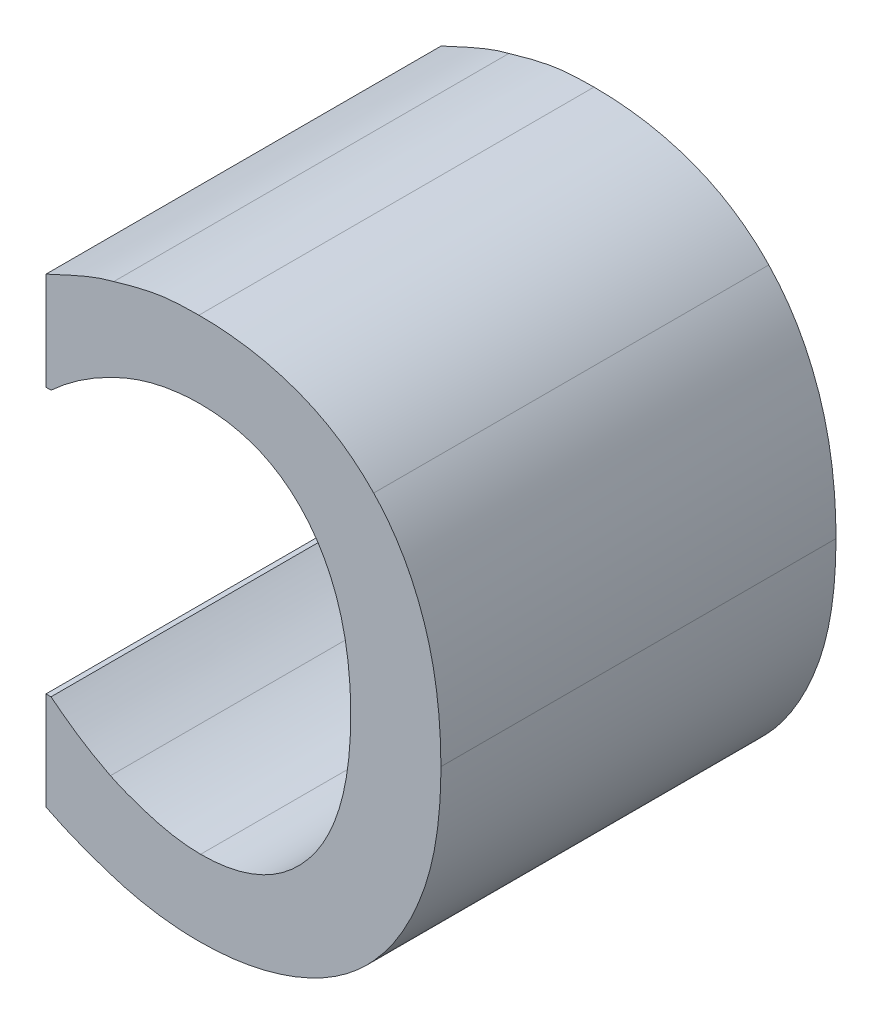
ISO-10303-21;
HEADER;
FILE_DESCRIPTION(('STEP AP214'),'2;1');
FILE_NAME('part.step','',(''),(''),'','','');
FILE_SCHEMA(('AUTOMOTIVE_DESIGN { 1 0 10303 214 1 1 1 1 }'));
ENDSEC;
DATA;
#1=APPLICATION_CONTEXT('core data for automotive mechanical design processes');
#2=APPLICATION_PROTOCOL_DEFINITION('international standard','automotive_design',2000,#1);
#3=PRODUCT_CONTEXT('',#1,'mechanical');
#4=PRODUCT('Part','Part','',(#3));
#5=PRODUCT_RELATED_PRODUCT_CATEGORY('part','',(#4));
#6=PRODUCT_DEFINITION_FORMATION('','',#4);
#7=PRODUCT_DEFINITION_CONTEXT('part definition',#1,'design');
#8=PRODUCT_DEFINITION('design','',#6,#7);
#9=PRODUCT_DEFINITION_SHAPE('','',#8);
#10=(LENGTH_UNIT() NAMED_UNIT(*) SI_UNIT(.MILLI.,.METRE.));
#11=(NAMED_UNIT(*) PLANE_ANGLE_UNIT() SI_UNIT($,.RADIAN.));
#12=(NAMED_UNIT(*) SI_UNIT($,.STERADIAN.) SOLID_ANGLE_UNIT());
#13=UNCERTAINTY_MEASURE_WITH_UNIT(LENGTH_MEASURE(1.E-05),#10,'distance_accuracy_value','');
#14=(GEOMETRIC_REPRESENTATION_CONTEXT(3) GLOBAL_UNCERTAINTY_ASSIGNED_CONTEXT((#13)) GLOBAL_UNIT_ASSIGNED_CONTEXT((#10,
#11,#12)) REPRESENTATION_CONTEXT('',''));
#15=CARTESIAN_POINT('',(0.,0.,0.));
#16=DIRECTION('',(0.,0.,1.));
#17=DIRECTION('',(1.,0.,0.));
#18=AXIS2_PLACEMENT_3D('',#15,#16,#17);
#19=CARTESIAN_POINT('',(5.9608266346337,1.5887755566552,0.));
#20=CARTESIAN_POINT('',(5.9608266346337,1.5887755566552,0.1));
#21=CARTESIAN_POINT('',(5.9608266346337,1.6060730616714,0.));
#22=CARTESIAN_POINT('',(5.9608266346337,1.6060730616714,0.1));
#23=CARTESIAN_POINT('',(5.9518943164696,1.6318775363677,0.));
#24=CARTESIAN_POINT('',(5.9518943164696,1.6318775363677,0.1));
#25=CARTESIAN_POINT('',(5.9438126952735,1.6402427232198,0.));
#26=CARTESIAN_POINT('',(5.9438126952735,1.6402427232198,0.1));
#27=B_SPLINE_SURFACE_WITH_KNOTS('',2,1,((#19,#20),(#21,#22),(#23,#24),(#25,#26)),.UNSPECIFIED.,
.F.,.F.,.F.,(3,1,3),(2,2),(-2.,-1.,0.),(0.,0.01),.UNSPECIFIED.);
#28=CARTESIAN_POINT('',(5.9438126952735,1.6402427232198,0.));
#29=CARTESIAN_POINT('',(5.9518943164696,1.6318775363677,0.));
#30=CARTESIAN_POINT('',(5.9608266346337,1.6060730616714,0.));
#31=CARTESIAN_POINT('',(5.9608266346337,1.5887755566552,0.));
#32=B_SPLINE_CURVE_WITH_KNOTS('',2,(#28,#29,#30,#31),.UNSPECIFIED.,.F.,.F.,(3,1,3),(0.,1.,2.),.UNSPECIFIED.);
#33=CARTESIAN_POINT('',(5.9438126952735,1.6402427232198,0.));
#34=VERTEX_POINT('',#33);
#35=CARTESIAN_POINT('',(5.9608266346337,1.5887755566552,0.));
#36=VERTEX_POINT('',#35);
#37=EDGE_CURVE('E11',#34,#36,#32,.T.);
#38=DIRECTION('',(0.,0.,1.));
#39=VECTOR('',#38,1.);
#40=CARTESIAN_POINT('',(5.9438126952735,1.6402427232198,0.));
#41=LINE('',#40,#39);
#42=CARTESIAN_POINT('',(5.9438126952735,1.6402427232198,0.1));
#43=VERTEX_POINT('',#42);
#44=EDGE_CURVE('E28',#34,#43,#41,.T.);
#45=CARTESIAN_POINT('',(5.9608266346337,1.5887755566552,0.1));
#46=CARTESIAN_POINT('',(5.9608266346337,1.6060730616714,0.1));
#47=CARTESIAN_POINT('',(5.9518943164696,1.6318775363677,0.1));
#48=CARTESIAN_POINT('',(5.9438126952735,1.6402427232198,0.1));
#49=B_SPLINE_CURVE_WITH_KNOTS('',2,(#45,#46,#47,#48),.UNSPECIFIED.,.F.,.F.,(3,1,3),(-2.,-1.,0.),.UNSPECIFIED.);
#50=CARTESIAN_POINT('',(5.9608266346337,1.5887755566552,0.1));
#51=VERTEX_POINT('',#50);
#52=EDGE_CURVE('E152',#51,#43,#49,.T.);
#53=DIRECTION('',(0.,0.,1.));
#54=VECTOR('',#53,1.);
#55=CARTESIAN_POINT('',(5.9608266346337,1.5887755566552,0.));
#56=LINE('',#55,#54);
#57=EDGE_CURVE('E364',#36,#51,#56,.T.);
#58=ORIENTED_EDGE('',*,*,#37,.F.);
#59=ORIENTED_EDGE('',*,*,#44,.T.);
#60=ORIENTED_EDGE('',*,*,#52,.F.);
#61=ORIENTED_EDGE('',*,*,#57,.F.);
#62=EDGE_LOOP('',(#58,#59,#60,#61));
#63=FACE_BOUND('',#62,.T.);
#64=ADVANCED_FACE('F17',(#63),#27,.T.);
#65=CARTESIAN_POINT('',(5.9438126952735,1.5377337385748,0.));
#66=CARTESIAN_POINT('',(5.9438126952735,1.5377337385748,0.1));
#67=CARTESIAN_POINT('',(5.9516107508136,1.5462407082548,0.));
#68=CARTESIAN_POINT('',(5.9516107508136,1.5462407082548,0.1));
#69=CARTESIAN_POINT('',(5.9608266346337,1.5714780516391,0.));
#70=CARTESIAN_POINT('',(5.9608266346337,1.5714780516391,0.1));
#71=CARTESIAN_POINT('',(5.9608266346337,1.5887755566552,0.));
#72=CARTESIAN_POINT('',(5.9608266346337,1.5887755566552,0.1));
#73=B_SPLINE_SURFACE_WITH_KNOTS('',2,1,((#65,#66),(#67,#68),(#69,#70),(#71,#72)),.UNSPECIFIED.,
.F.,.F.,.F.,(3,1,3),(2,2),(-2.,-1.,0.),(0.,0.01),.UNSPECIFIED.);
#74=CARTESIAN_POINT('',(5.9608266346337,1.5887755566552,0.));
#75=CARTESIAN_POINT('',(5.9608266346337,1.5714780516391,0.));
#76=CARTESIAN_POINT('',(5.9516107508136,1.5462407082548,0.));
#77=CARTESIAN_POINT('',(5.9438126952735,1.5377337385748,0.));
#78=B_SPLINE_CURVE_WITH_KNOTS('',2,(#74,#75,#76,#77),.UNSPECIFIED.,.F.,.F.,(3,1,3),(0.,1.,2.),.UNSPECIFIED.);
#79=CARTESIAN_POINT('',(5.9438126952735,1.5377337385748,0.));
#80=VERTEX_POINT('',#79);
#81=EDGE_CURVE('E357',#36,#80,#78,.T.);
#82=CARTESIAN_POINT('',(5.9438126952735,1.5377337385748,0.1));
#83=CARTESIAN_POINT('',(5.9516107508136,1.5462407082548,0.1));
#84=CARTESIAN_POINT('',(5.9608266346337,1.5714780516391,0.1));
#85=CARTESIAN_POINT('',(5.9608266346337,1.5887755566552,0.1));
#86=B_SPLINE_CURVE_WITH_KNOTS('',2,(#82,#83,#84,#85),.UNSPECIFIED.,.F.,.F.,(3,1,3),(-2.,-1.,0.),.UNSPECIFIED.);
#87=CARTESIAN_POINT('',(5.9438126952735,1.5377337385748,0.1));
#88=VERTEX_POINT('',#87);
#89=EDGE_CURVE('E353',#88,#51,#86,.T.);
#90=DIRECTION('',(0.,0.,1.));
#91=VECTOR('',#90,1.);
#92=CARTESIAN_POINT('',(5.9438126952735,1.5377337385748,0.));
#93=LINE('',#92,#91);
#94=EDGE_CURVE('E347',#80,#88,#93,.T.);
#95=ORIENTED_EDGE('',*,*,#81,.F.);
#96=ORIENTED_EDGE('',*,*,#57,.T.);
#97=ORIENTED_EDGE('',*,*,#89,.F.);
#98=ORIENTED_EDGE('',*,*,#94,.F.);
#99=EDGE_LOOP('',(#95,#96,#97,#98));
#100=FACE_BOUND('',#99,.T.);
#101=ADVANCED_FACE('F426',(#100),#73,.T.);
#102=CARTESIAN_POINT('',(5.8995764529371,1.5198691022466,0.));
#103=CARTESIAN_POINT('',(5.8995764529371,1.5198691022466,0.1));
#104=CARTESIAN_POINT('',(5.9129040387692,1.5198691022466,0.));
#105=CARTESIAN_POINT('',(5.9129040387692,1.5198691022466,0.1));
#106=CARTESIAN_POINT('',(5.9360146397334,1.5290849860667,0.));
#107=CARTESIAN_POINT('',(5.9360146397334,1.5290849860667,0.1));
#108=CARTESIAN_POINT('',(5.9438126952735,1.5377337385748,0.));
#109=CARTESIAN_POINT('',(5.9438126952735,1.5377337385748,0.1));
#110=B_SPLINE_SURFACE_WITH_KNOTS('',2,1,((#102,#103),(#104,#105),(#106,#107),(#108,#109)),
.UNSPECIFIED.,.F.,.F.,.F.,(3,1,3),(2,2),(-2.,-1.,0.),(0.,0.01),.UNSPECIFIED.);
#111=CARTESIAN_POINT('',(5.9438126952735,1.5377337385748,0.));
#112=CARTESIAN_POINT('',(5.9360146397334,1.5290849860667,0.));
#113=CARTESIAN_POINT('',(5.9129040387692,1.5198691022466,0.));
#114=CARTESIAN_POINT('',(5.8995764529371,1.5198691022466,0.));
#115=B_SPLINE_CURVE_WITH_KNOTS('',2,(#111,#112,#113,#114),.UNSPECIFIED.,.F.,.F.,(3,1,3),(0.,1.,
2.),.UNSPECIFIED.);
#116=CARTESIAN_POINT('',(5.8995764529371,1.5198691022466,0.));
#117=VERTEX_POINT('',#116);
#118=EDGE_CURVE('E340',#80,#117,#115,.T.);
#119=CARTESIAN_POINT('',(5.8995764529371,1.5198691022466,0.1));
#120=CARTESIAN_POINT('',(5.9129040387692,1.5198691022466,0.1));
#121=CARTESIAN_POINT('',(5.9360146397334,1.5290849860667,0.1));
#122=CARTESIAN_POINT('',(5.9438126952735,1.5377337385748,0.1));
#123=B_SPLINE_CURVE_WITH_KNOTS('',2,(#119,#120,#121,#122),.UNSPECIFIED.,.F.,.F.,(3,1,3),(-2.,
-1.,0.),.UNSPECIFIED.);
#124=CARTESIAN_POINT('',(5.8995764529371,1.5198691022466,0.1));
#125=VERTEX_POINT('',#124);
#126=EDGE_CURVE('E335',#125,#88,#123,.T.);
#127=DIRECTION('',(0.,0.,1.));
#128=VECTOR('',#127,1.);
#129=CARTESIAN_POINT('',(5.8995764529371,1.5198691022466,0.));
#130=LINE('',#129,#128);
#131=EDGE_CURVE('E329',#117,#125,#130,.T.);
#132=ORIENTED_EDGE('',*,*,#118,.F.);
#133=ORIENTED_EDGE('',*,*,#94,.T.);
#134=ORIENTED_EDGE('',*,*,#126,.F.);
#135=ORIENTED_EDGE('',*,*,#131,.F.);
#136=EDGE_LOOP('',(#132,#133,#134,#135));
#137=FACE_BOUND('',#136,.T.);
#138=ADVANCED_FACE('F422',(#137),#110,.T.);
#139=CARTESIAN_POINT('',(5.8608697408927,1.5299356830347,0.));
#140=CARTESIAN_POINT('',(5.8608697408927,1.5299356830347,0.1));
#141=CARTESIAN_POINT('',(5.8686677964328,1.5259657638506,0.));
#142=CARTESIAN_POINT('',(5.8686677964328,1.5259657638506,0.1));
#143=CARTESIAN_POINT('',(5.888800958009,1.5198691022466,0.));
#144=CARTESIAN_POINT('',(5.888800958009,1.5198691022466,0.1));
#145=CARTESIAN_POINT('',(5.8995764529371,1.5198691022466,0.));
#146=CARTESIAN_POINT('',(5.8995764529371,1.5198691022466,0.1));
#147=B_SPLINE_SURFACE_WITH_KNOTS('',2,1,((#139,#140),(#141,#142),(#143,#144),(#145,#146)),
.UNSPECIFIED.,.F.,.F.,.F.,(3,1,3),(2,2),(-2.,-1.,0.),(0.,0.01),.UNSPECIFIED.);
#148=CARTESIAN_POINT('',(5.8995764529371,1.5198691022466,0.));
#149=CARTESIAN_POINT('',(5.888800958009,1.5198691022466,0.));
#150=CARTESIAN_POINT('',(5.8686677964328,1.5259657638506,0.));
#151=CARTESIAN_POINT('',(5.8608697408927,1.5299356830347,0.));
#152=B_SPLINE_CURVE_WITH_KNOTS('',2,(#148,#149,#150,#151),.UNSPECIFIED.,.F.,.F.,(3,1,3),(0.,1.,
2.),.UNSPECIFIED.);
#153=CARTESIAN_POINT('',(5.8608697408927,1.5299356830347,0.));
#154=VERTEX_POINT('',#153);
#155=EDGE_CURVE('E322',#117,#154,#152,.T.);
#156=CARTESIAN_POINT('',(5.8608697408927,1.5299356830347,0.1));
#157=CARTESIAN_POINT('',(5.8686677964328,1.5259657638506,0.1));
#158=CARTESIAN_POINT('',(5.888800958009,1.5198691022466,0.1));
#159=CARTESIAN_POINT('',(5.8995764529371,1.5198691022466,0.1));
#160=B_SPLINE_CURVE_WITH_KNOTS('',2,(#156,#157,#158,#159),.UNSPECIFIED.,.F.,.F.,(3,1,3),(-2.,
-1.,0.),.UNSPECIFIED.);
#161=CARTESIAN_POINT('',(5.8608697408927,1.5299356830347,0.1));
#162=VERTEX_POINT('',#161);
#163=EDGE_CURVE('E317',#162,#125,#160,.T.);
#164=DIRECTION('',(0.,0.,1.));
#165=VECTOR('',#164,1.);
#166=CARTESIAN_POINT('',(5.8608697408927,1.5299356830347,0.));
#167=LINE('',#166,#165);
#168=EDGE_CURVE('E314',#154,#162,#167,.T.);
#169=ORIENTED_EDGE('',*,*,#155,.F.);
#170=ORIENTED_EDGE('',*,*,#131,.T.);
#171=ORIENTED_EDGE('',*,*,#163,.F.);
#172=ORIENTED_EDGE('',*,*,#168,.F.);
#173=EDGE_LOOP('',(#169,#170,#171,#172));
#174=FACE_BOUND('',#173,.T.);
#175=ADVANCED_FACE('F418',(#174),#147,.T.);
#176=CARTESIAN_POINT('',(5.8608697408927,1.5547476779349,0.));
#177=DIRECTION('',(-1.,0.,0.));
#178=DIRECTION('',(0.,-1.,0.));
#179=AXIS2_PLACEMENT_3D('',#176,#177,#178);
#180=PLANE('',#179);
#181=DIRECTION('',(0.,1.,0.));
#182=VECTOR('',#181,1.);
#183=CARTESIAN_POINT('',(5.8608697408927,1.5299356830347,0.));
#184=LINE('',#183,#182);
#185=CARTESIAN_POINT('',(5.8608697408927,1.5547476779349,0.));
#186=VERTEX_POINT('',#185);
#187=EDGE_CURVE('E312',#154,#186,#184,.T.);
#188=ORIENTED_EDGE('',*,*,#187,.F.);
#189=ORIENTED_EDGE('',*,*,#168,.T.);
#190=DIRECTION('',(0.,-1.,0.));
#191=VECTOR('',#190,1.);
#192=CARTESIAN_POINT('',(5.8608697408927,1.5299356830347,0.1));
#193=LINE('',#192,#191);
#194=CARTESIAN_POINT('',(5.8608697408927,1.5547476779349,0.1));
#195=VERTEX_POINT('',#194);
#196=EDGE_CURVE('E309',#195,#162,#193,.T.);
#197=ORIENTED_EDGE('',*,*,#196,.F.);
#198=DIRECTION('',(0.,0.,1.));
#199=VECTOR('',#198,1.);
#200=CARTESIAN_POINT('',(5.8608697408927,1.5547476779349,0.));
#201=LINE('',#200,#199);
#202=EDGE_CURVE('E306',#186,#195,#201,.T.);
#203=ORIENTED_EDGE('',*,*,#202,.F.);
#204=EDGE_LOOP('',(#188,#189,#197,#203));
#205=FACE_BOUND('',#204,.T.);
#206=ADVANCED_FACE('F414',(#205),#180,.T.);
#207=CARTESIAN_POINT('',(5.8621457863447,1.5547476779349,0.));
#208=DIRECTION('',(0.,1.,0.));
#209=DIRECTION('',(-1.,0.,0.));
#210=AXIS2_PLACEMENT_3D('',#207,#208,#209);
#211=PLANE('',#210);
#212=DIRECTION('',(1.,0.,0.));
#213=VECTOR('',#212,1.);
#214=CARTESIAN_POINT('',(5.8608697408927,1.5547476779349,0.));
#215=LINE('',#214,#213);
#216=CARTESIAN_POINT('',(5.8621457863447,1.5547476779349,0.));
#217=VERTEX_POINT('',#216);
#218=EDGE_CURVE('E304',#186,#217,#215,.T.);
#219=ORIENTED_EDGE('',*,*,#218,.F.);
#220=ORIENTED_EDGE('',*,*,#202,.T.);
#221=DIRECTION('',(-1.,0.,0.));
#222=VECTOR('',#221,1.);
#223=CARTESIAN_POINT('',(5.8608697408927,1.5547476779349,0.1));
#224=LINE('',#223,#222);
#225=CARTESIAN_POINT('',(5.8621457863447,1.5547476779349,0.1));
#226=VERTEX_POINT('',#225);
#227=EDGE_CURVE('E301',#226,#195,#224,.T.);
#228=ORIENTED_EDGE('',*,*,#227,.F.);
#229=DIRECTION('',(0.,0.,1.));
#230=VECTOR('',#229,1.);
#231=CARTESIAN_POINT('',(5.8621457863447,1.5547476779349,0.));
#232=LINE('',#231,#230);
#233=EDGE_CURVE('E295',#217,#226,#232,.T.);
#234=ORIENTED_EDGE('',*,*,#233,.F.);
#235=EDGE_LOOP('',(#219,#220,#228,#234));
#236=FACE_BOUND('',#235,.T.);
#237=ADVANCED_FACE('F410',(#236),#211,.T.);
#238=CARTESIAN_POINT('',(5.8771747661129,1.5449646628028,0.));
#239=CARTESIAN_POINT('',(5.8771747661129,1.5449646628028,0.1));
#240=CARTESIAN_POINT('',(5.8719288014768,1.5476585365349,0.));
#241=CARTESIAN_POINT('',(5.8719288014768,1.5476585365349,0.1));
#242=CARTESIAN_POINT('',(5.8645560944207,1.5527627183429,0.));
#243=CARTESIAN_POINT('',(5.8645560944207,1.5527627183429,0.1));
#244=CARTESIAN_POINT('',(5.8621457863447,1.5547476779349,0.));
#245=CARTESIAN_POINT('',(5.8621457863447,1.5547476779349,0.1));
#246=B_SPLINE_SURFACE_WITH_KNOTS('',2,1,((#238,#239),(#240,#241),(#242,#243),(#244,#245)),
.UNSPECIFIED.,.F.,.F.,.F.,(3,1,3),(2,2),(-2.,-1.,0.),(0.,0.01),.UNSPECIFIED.);
#247=CARTESIAN_POINT('',(5.8621457863447,1.5547476779349,0.));
#248=CARTESIAN_POINT('',(5.8645560944207,1.5527627183429,0.));
#249=CARTESIAN_POINT('',(5.8719288014768,1.5476585365349,0.));
#250=CARTESIAN_POINT('',(5.8771747661129,1.5449646628028,0.));
#251=B_SPLINE_CURVE_WITH_KNOTS('',2,(#247,#248,#249,#250),.UNSPECIFIED.,.F.,.F.,(3,1,3),(0.,1.,
2.),.UNSPECIFIED.);
#252=CARTESIAN_POINT('',(5.8771747661129,1.5449646628028,0.));
#253=VERTEX_POINT('',#252);
#254=EDGE_CURVE('E288',#217,#253,#251,.T.);
#255=CARTESIAN_POINT('',(5.8771747661129,1.5449646628028,0.1));
#256=CARTESIAN_POINT('',(5.8719288014768,1.5476585365349,0.1));
#257=CARTESIAN_POINT('',(5.8645560944207,1.5527627183429,0.1));
#258=CARTESIAN_POINT('',(5.8621457863447,1.5547476779349,0.1));
#259=B_SPLINE_CURVE_WITH_KNOTS('',2,(#255,#256,#257,#258),.UNSPECIFIED.,.F.,.F.,(3,1,3),(-2.,
-1.,0.),.UNSPECIFIED.);
#260=CARTESIAN_POINT('',(5.8771747661129,1.5449646628028,0.1));
#261=VERTEX_POINT('',#260);
#262=EDGE_CURVE('E283',#261,#226,#259,.T.);
#263=DIRECTION('',(0.,0.,1.));
#264=VECTOR('',#263,1.);
#265=CARTESIAN_POINT('',(5.8771747661129,1.5449646628028,0.));
#266=LINE('',#265,#264);
#267=EDGE_CURVE('E277',#253,#261,#266,.T.);
#268=ORIENTED_EDGE('',*,*,#254,.F.);
#269=ORIENTED_EDGE('',*,*,#233,.T.);
#270=ORIENTED_EDGE('',*,*,#262,.F.);
#271=ORIENTED_EDGE('',*,*,#267,.F.);
#272=EDGE_LOOP('',(#268,#269,#270,#271));
#273=FACE_BOUND('',#272,.T.);
#274=ADVANCED_FACE('F406',(#273),#246,.T.);
#275=CARTESIAN_POINT('',(5.9000018014211,1.5391515668548,0.));
#276=CARTESIAN_POINT('',(5.9000018014211,1.5391515668548,0.1));
#277=CARTESIAN_POINT('',(5.894330488301,1.5391515668548,0.));
#278=CARTESIAN_POINT('',(5.894330488301,1.5391515668548,0.1));
#279=CARTESIAN_POINT('',(5.8818535994369,1.5426961375548,0.));
#280=CARTESIAN_POINT('',(5.8818535994369,1.5426961375548,0.1));
#281=CARTESIAN_POINT('',(5.8771747661129,1.5449646628028,0.));
#282=CARTESIAN_POINT('',(5.8771747661129,1.5449646628028,0.1));
#283=B_SPLINE_SURFACE_WITH_KNOTS('',2,1,((#275,#276),(#277,#278),(#279,#280),(#281,#282)),
.UNSPECIFIED.,.F.,.F.,.F.,(3,1,3),(2,2),(-2.,-1.,0.),(0.,0.01),.UNSPECIFIED.);
#284=CARTESIAN_POINT('',(5.8771747661129,1.5449646628028,0.));
#285=CARTESIAN_POINT('',(5.8818535994369,1.5426961375548,0.));
#286=CARTESIAN_POINT('',(5.894330488301,1.5391515668548,0.));
#287=CARTESIAN_POINT('',(5.9000018014211,1.5391515668548,0.));
#288=B_SPLINE_CURVE_WITH_KNOTS('',2,(#284,#285,#286,#287),.UNSPECIFIED.,.F.,.F.,(3,1,3),(0.,1.,
2.),.UNSPECIFIED.);
#289=CARTESIAN_POINT('',(5.9000018014211,1.5391515668548,0.));
#290=VERTEX_POINT('',#289);
#291=EDGE_CURVE('E270',#253,#290,#288,.T.);
#292=CARTESIAN_POINT('',(5.9000018014211,1.5391515668548,0.1));
#293=CARTESIAN_POINT('',(5.894330488301,1.5391515668548,0.1));
#294=CARTESIAN_POINT('',(5.8818535994369,1.5426961375548,0.1));
#295=CARTESIAN_POINT('',(5.8771747661129,1.5449646628028,0.1));
#296=B_SPLINE_CURVE_WITH_KNOTS('',2,(#292,#293,#294,#295),.UNSPECIFIED.,.F.,.F.,(3,1,3),(-2.,
-1.,0.),.UNSPECIFIED.);
#297=CARTESIAN_POINT('',(5.9000018014211,1.5391515668548,0.1));
#298=VERTEX_POINT('',#297);
#299=EDGE_CURVE('E265',#298,#261,#296,.T.);
#300=DIRECTION('',(0.,0.,1.));
#301=VECTOR('',#300,1.);
#302=CARTESIAN_POINT('',(5.9000018014211,1.5391515668548,0.));
#303=LINE('',#302,#301);
#304=EDGE_CURVE('E259',#290,#298,#303,.T.);
#305=ORIENTED_EDGE('',*,*,#291,.F.);
#306=ORIENTED_EDGE('',*,*,#267,.T.);
#307=ORIENTED_EDGE('',*,*,#299,.F.);
#308=ORIENTED_EDGE('',*,*,#304,.F.);
#309=EDGE_LOOP('',(#305,#306,#307,#308));
#310=FACE_BOUND('',#309,.T.);
#311=ADVANCED_FACE('F402',(#310),#283,.T.);
#312=CARTESIAN_POINT('',(5.9379995993254,1.5887755566552,0.));
#313=CARTESIAN_POINT('',(5.9379995993254,1.5887755566552,0.1));
#314=CARTESIAN_POINT('',(5.9379995993254,1.565097824379,0.));
#315=CARTESIAN_POINT('',(5.9379995993254,1.565097824379,0.1));
#316=CARTESIAN_POINT('',(5.9171575236092,1.5391515668548,0.));
#317=CARTESIAN_POINT('',(5.9171575236092,1.5391515668548,0.1));
#318=CARTESIAN_POINT('',(5.9000018014211,1.5391515668548,0.));
#319=CARTESIAN_POINT('',(5.9000018014211,1.5391515668548,0.1));
#320=B_SPLINE_SURFACE_WITH_KNOTS('',2,1,((#312,#313),(#314,#315),(#316,#317),(#318,#319)),
.UNSPECIFIED.,.F.,.F.,.F.,(3,1,3),(2,2),(-2.,-1.,0.),(0.,0.01),.UNSPECIFIED.);
#321=CARTESIAN_POINT('',(5.9000018014211,1.5391515668548,0.));
#322=CARTESIAN_POINT('',(5.9171575236092,1.5391515668548,0.));
#323=CARTESIAN_POINT('',(5.9379995993254,1.565097824379,0.));
#324=CARTESIAN_POINT('',(5.9379995993254,1.5887755566552,0.));
#325=B_SPLINE_CURVE_WITH_KNOTS('',2,(#321,#322,#323,#324),.UNSPECIFIED.,.F.,.F.,(3,1,3),(0.,1.,
2.),.UNSPECIFIED.);
#326=CARTESIAN_POINT('',(5.9379995993254,1.5887755566552,0.));
#327=VERTEX_POINT('',#326);
#328=EDGE_CURVE('E252',#290,#327,#325,.T.);
#329=CARTESIAN_POINT('',(5.9379995993254,1.5887755566552,0.1));
#330=CARTESIAN_POINT('',(5.9379995993254,1.565097824379,0.1));
#331=CARTESIAN_POINT('',(5.9171575236092,1.5391515668548,0.1));
#332=CARTESIAN_POINT('',(5.9000018014211,1.5391515668548,0.1));
#333=B_SPLINE_CURVE_WITH_KNOTS('',2,(#329,#330,#331,#332),.UNSPECIFIED.,.F.,.F.,(3,1,3),(-2.,
-1.,0.),.UNSPECIFIED.);
#334=CARTESIAN_POINT('',(5.9379995993254,1.5887755566552,0.1));
#335=VERTEX_POINT('',#334);
#336=EDGE_CURVE('E247',#335,#298,#333,.T.);
#337=DIRECTION('',(0.,0.,1.));
#338=VECTOR('',#337,1.);
#339=CARTESIAN_POINT('',(5.9379995993254,1.5887755566552,0.));
#340=LINE('',#339,#338);
#341=EDGE_CURVE('E241',#327,#335,#340,.T.);
#342=ORIENTED_EDGE('',*,*,#328,.F.);
#343=ORIENTED_EDGE('',*,*,#304,.T.);
#344=ORIENTED_EDGE('',*,*,#336,.F.);
#345=ORIENTED_EDGE('',*,*,#341,.F.);
#346=EDGE_LOOP('',(#342,#343,#344,#345));
#347=FACE_BOUND('',#346,.T.);
#348=ADVANCED_FACE('F398',(#347),#320,.T.);
#349=CARTESIAN_POINT('',(5.9000018014211,1.6378324151437,0.));
#350=CARTESIAN_POINT('',(5.9000018014211,1.6378324151437,0.1));
#351=CARTESIAN_POINT('',(5.9178664377493,1.6378324151437,0.));
#352=CARTESIAN_POINT('',(5.9178664377493,1.6378324151437,0.1));
#353=CARTESIAN_POINT('',(5.9379995993254,1.6118861576195,0.));
#354=CARTESIAN_POINT('',(5.9379995993254,1.6118861576195,0.1));
#355=CARTESIAN_POINT('',(5.9379995993254,1.5887755566552,0.));
#356=CARTESIAN_POINT('',(5.9379995993254,1.5887755566552,0.1));
#357=B_SPLINE_SURFACE_WITH_KNOTS('',2,1,((#349,#350),(#351,#352),(#353,#354),(#355,#356)),
.UNSPECIFIED.,.F.,.F.,.F.,(3,1,3),(2,2),(-2.,-1.,0.),(0.,0.01),.UNSPECIFIED.);
#358=CARTESIAN_POINT('',(5.9379995993254,1.5887755566552,0.));
#359=CARTESIAN_POINT('',(5.9379995993254,1.6118861576195,0.));
#360=CARTESIAN_POINT('',(5.9178664377493,1.6378324151437,0.));
#361=CARTESIAN_POINT('',(5.9000018014211,1.6378324151437,0.));
#362=B_SPLINE_CURVE_WITH_KNOTS('',2,(#358,#359,#360,#361),.UNSPECIFIED.,.F.,.F.,(3,1,3),(0.,1.,
2.),.UNSPECIFIED.);
#363=CARTESIAN_POINT('',(5.9000018014211,1.6378324151437,0.));
#364=VERTEX_POINT('',#363);
#365=EDGE_CURVE('E234',#327,#364,#362,.T.);
#366=CARTESIAN_POINT('',(5.9000018014211,1.6378324151437,0.1));
#367=CARTESIAN_POINT('',(5.9178664377493,1.6378324151437,0.1));
#368=CARTESIAN_POINT('',(5.9379995993254,1.6118861576195,0.1));
#369=CARTESIAN_POINT('',(5.9379995993254,1.5887755566552,0.1));
#370=B_SPLINE_CURVE_WITH_KNOTS('',2,(#366,#367,#368,#369),.UNSPECIFIED.,.F.,.F.,(3,1,3),(-2.,
-1.,0.),.UNSPECIFIED.);
#371=CARTESIAN_POINT('',(5.9000018014211,1.6378324151437,0.1));
#372=VERTEX_POINT('',#371);
#373=EDGE_CURVE('E229',#372,#335,#370,.T.);
#374=DIRECTION('',(0.,0.,1.));
#375=VECTOR('',#374,1.);
#376=CARTESIAN_POINT('',(5.9000018014211,1.6378324151437,0.));
#377=LINE('',#376,#375);
#378=EDGE_CURVE('E223',#364,#372,#377,.T.);
#379=ORIENTED_EDGE('',*,*,#365,.F.);
#380=ORIENTED_EDGE('',*,*,#341,.T.);
#381=ORIENTED_EDGE('',*,*,#373,.F.);
#382=ORIENTED_EDGE('',*,*,#378,.F.);
#383=EDGE_LOOP('',(#379,#380,#381,#382));
#384=FACE_BOUND('',#383,.T.);
#385=ADVANCED_FACE('F394',(#384),#357,.T.);
#386=CARTESIAN_POINT('',(5.8621457863447,1.6219527384076,0.));
#387=CARTESIAN_POINT('',(5.8621457863447,1.6219527384076,0.1));
#388=CARTESIAN_POINT('',(5.8696602762288,1.6289000969796,0.));
#389=CARTESIAN_POINT('',(5.8696602762288,1.6289000969796,0.1));
#390=CARTESIAN_POINT('',(5.889226306493,1.6378324151437,0.));
#391=CARTESIAN_POINT('',(5.889226306493,1.6378324151437,0.1));
#392=CARTESIAN_POINT('',(5.9000018014211,1.6378324151437,0.));
#393=CARTESIAN_POINT('',(5.9000018014211,1.6378324151437,0.1));
#394=B_SPLINE_SURFACE_WITH_KNOTS('',2,1,((#386,#387),(#388,#389),(#390,#391),(#392,#393)),
.UNSPECIFIED.,.F.,.F.,.F.,(3,1,3),(2,2),(-2.,-1.,0.),(0.,0.01),.UNSPECIFIED.);
#395=CARTESIAN_POINT('',(5.9000018014211,1.6378324151437,0.));
#396=CARTESIAN_POINT('',(5.889226306493,1.6378324151437,0.));
#397=CARTESIAN_POINT('',(5.8696602762288,1.6289000969796,0.));
#398=CARTESIAN_POINT('',(5.8621457863447,1.6219527384076,0.));
#399=B_SPLINE_CURVE_WITH_KNOTS('',2,(#395,#396,#397,#398),.UNSPECIFIED.,.F.,.F.,(3,1,3),(0.,1.,
2.),.UNSPECIFIED.);
#400=CARTESIAN_POINT('',(5.8621457863447,1.6219527384076,0.));
#401=VERTEX_POINT('',#400);
#402=EDGE_CURVE('E216',#364,#401,#399,.T.);
#403=CARTESIAN_POINT('',(5.8621457863447,1.6219527384076,0.1));
#404=CARTESIAN_POINT('',(5.8696602762288,1.6289000969796,0.1));
#405=CARTESIAN_POINT('',(5.889226306493,1.6378324151437,0.1));
#406=CARTESIAN_POINT('',(5.9000018014211,1.6378324151437,0.1));
#407=B_SPLINE_CURVE_WITH_KNOTS('',2,(#403,#404,#405,#406),.UNSPECIFIED.,.F.,.F.,(3,1,3),(-2.,
-1.,0.),.UNSPECIFIED.);
#408=CARTESIAN_POINT('',(5.8621457863447,1.6219527384076,0.1));
#409=VERTEX_POINT('',#408);
#410=EDGE_CURVE('E211',#409,#372,#407,.T.);
#411=DIRECTION('',(0.,0.,1.));
#412=VECTOR('',#411,1.);
#413=CARTESIAN_POINT('',(5.8621457863447,1.6219527384076,0.));
#414=LINE('',#413,#412);
#415=EDGE_CURVE('E208',#401,#409,#414,.T.);
#416=ORIENTED_EDGE('',*,*,#402,.F.);
#417=ORIENTED_EDGE('',*,*,#378,.T.);
#418=ORIENTED_EDGE('',*,*,#410,.F.);
#419=ORIENTED_EDGE('',*,*,#415,.F.);
#420=EDGE_LOOP('',(#416,#417,#418,#419));
#421=FACE_BOUND('',#420,.T.);
#422=ADVANCED_FACE('F390',(#421),#394,.T.);
#423=CARTESIAN_POINT('',(5.8608697408927,1.6219527384076,0.));
#424=DIRECTION('',(0.,-1.,0.));
#425=DIRECTION('',(1.,0.,0.));
#426=AXIS2_PLACEMENT_3D('',#423,#424,#425);
#427=PLANE('',#426);
#428=DIRECTION('',(-1.,0.,0.));
#429=VECTOR('',#428,1.);
#430=CARTESIAN_POINT('',(5.8621457863447,1.6219527384076,0.));
#431=LINE('',#430,#429);
#432=CARTESIAN_POINT('',(5.8608697408927,1.6219527384076,0.));
#433=VERTEX_POINT('',#432);
#434=EDGE_CURVE('E206',#401,#433,#431,.T.);
#435=ORIENTED_EDGE('',*,*,#434,.F.);
#436=ORIENTED_EDGE('',*,*,#415,.T.);
#437=DIRECTION('',(1.,0.,0.));
#438=VECTOR('',#437,1.);
#439=CARTESIAN_POINT('',(5.8621457863447,1.6219527384076,0.1));
#440=LINE('',#439,#438);
#441=CARTESIAN_POINT('',(5.8608697408927,1.6219527384076,0.1));
#442=VERTEX_POINT('',#441);
#443=EDGE_CURVE('E203',#442,#409,#440,.T.);
#444=ORIENTED_EDGE('',*,*,#443,.F.);
#445=DIRECTION('',(0.,0.,1.));
#446=VECTOR('',#445,1.);
#447=CARTESIAN_POINT('',(5.8608697408927,1.6219527384076,0.));
#448=LINE('',#447,#446);
#449=EDGE_CURVE('E200',#433,#442,#448,.T.);
#450=ORIENTED_EDGE('',*,*,#449,.F.);
#451=EDGE_LOOP('',(#435,#436,#444,#450));
#452=FACE_BOUND('',#451,.T.);
#453=ADVANCED_FACE('F386',(#452),#427,.T.);
#454=CARTESIAN_POINT('',(5.8608697408927,1.6467647333078,0.));
#455=DIRECTION('',(-1.,0.,0.));
#456=DIRECTION('',(0.,-1.,0.));
#457=AXIS2_PLACEMENT_3D('',#454,#455,#456);
#458=PLANE('',#457);
#459=DIRECTION('',(0.,1.,0.));
#460=VECTOR('',#459,1.);
#461=CARTESIAN_POINT('',(5.8608697408927,1.6219527384076,0.));
#462=LINE('',#461,#460);
#463=CARTESIAN_POINT('',(5.8608697408927,1.6467647333078,0.));
#464=VERTEX_POINT('',#463);
#465=EDGE_CURVE('E198',#433,#464,#462,.T.);
#466=ORIENTED_EDGE('',*,*,#465,.F.);
#467=ORIENTED_EDGE('',*,*,#449,.T.);
#468=DIRECTION('',(0.,-1.,0.));
#469=VECTOR('',#468,1.);
#470=CARTESIAN_POINT('',(5.8608697408927,1.6219527384076,0.1));
#471=LINE('',#470,#469);
#472=CARTESIAN_POINT('',(5.8608697408927,1.6467647333078,0.1));
#473=VERTEX_POINT('',#472);
#474=EDGE_CURVE('E195',#473,#442,#471,.T.);
#475=ORIENTED_EDGE('',*,*,#474,.F.);
#476=DIRECTION('',(0.,0.,1.));
#477=VECTOR('',#476,1.);
#478=CARTESIAN_POINT('',(5.8608697408927,1.6467647333078,0.));
#479=LINE('',#478,#477);
#480=EDGE_CURVE('E189',#464,#473,#479,.T.);
#481=ORIENTED_EDGE('',*,*,#480,.F.);
#482=EDGE_LOOP('',(#466,#467,#475,#481));
#483=FACE_BOUND('',#482,.T.);
#484=ADVANCED_FACE('F382',(#483),#458,.T.);
#485=CARTESIAN_POINT('',(5.8780254630809,1.6537120918799,0.));
#486=CARTESIAN_POINT('',(5.8780254630809,1.6537120918799,0.1));
#487=CARTESIAN_POINT('',(5.8740555438968,1.6527196120839,0.));
#488=CARTESIAN_POINT('',(5.8740555438968,1.6527196120839,0.1));
#489=CARTESIAN_POINT('',(5.8641307459367,1.6483243444158,0.));
#490=CARTESIAN_POINT('',(5.8641307459367,1.6483243444158,0.1));
#491=CARTESIAN_POINT('',(5.8608697408927,1.6467647333078,0.));
#492=CARTESIAN_POINT('',(5.8608697408927,1.6467647333078,0.1));
#493=B_SPLINE_SURFACE_WITH_KNOTS('',2,1,((#485,#486),(#487,#488),(#489,#490),(#491,#492)),
.UNSPECIFIED.,.F.,.F.,.F.,(3,1,3),(2,2),(-2.,-1.,0.),(0.,0.01),.UNSPECIFIED.);
#494=CARTESIAN_POINT('',(5.8608697408927,1.6467647333078,0.));
#495=CARTESIAN_POINT('',(5.8641307459367,1.6483243444158,0.));
#496=CARTESIAN_POINT('',(5.8740555438968,1.6527196120839,0.));
#497=CARTESIAN_POINT('',(5.8780254630809,1.6537120918799,0.));
#498=B_SPLINE_CURVE_WITH_KNOTS('',2,(#494,#495,#496,#497),.UNSPECIFIED.,.F.,.F.,(3,1,3),(0.,1.,
2.),.UNSPECIFIED.);
#499=CARTESIAN_POINT('',(5.8780254630809,1.6537120918799,0.));
#500=VERTEX_POINT('',#499);
#501=EDGE_CURVE('E182',#464,#500,#498,.T.);
#502=CARTESIAN_POINT('',(5.8780254630809,1.6537120918799,0.1));
#503=CARTESIAN_POINT('',(5.8740555438968,1.6527196120839,0.1));
#504=CARTESIAN_POINT('',(5.8641307459367,1.6483243444158,0.1));
#505=CARTESIAN_POINT('',(5.8608697408927,1.6467647333078,0.1));
#506=B_SPLINE_CURVE_WITH_KNOTS('',2,(#502,#503,#504,#505),.UNSPECIFIED.,.F.,.F.,(3,1,3),(-2.,
-1.,0.),.UNSPECIFIED.);
#507=CARTESIAN_POINT('',(5.8780254630809,1.6537120918799,0.1));
#508=VERTEX_POINT('',#507);
#509=EDGE_CURVE('E178',#508,#473,#506,.T.);
#510=DIRECTION('',(0.,0.,1.));
#511=VECTOR('',#510,1.);
#512=CARTESIAN_POINT('',(5.8780254630809,1.6537120918799,0.));
#513=LINE('',#512,#511);
#514=EDGE_CURVE('E137',#500,#508,#513,.T.);
#515=ORIENTED_EDGE('',*,*,#501,.F.);
#516=ORIENTED_EDGE('',*,*,#480,.T.);
#517=ORIENTED_EDGE('',*,*,#509,.F.);
#518=ORIENTED_EDGE('',*,*,#514,.F.);
#519=EDGE_LOOP('',(#515,#516,#517,#518));
#520=FACE_BOUND('',#519,.T.);
#521=ADVANCED_FACE('F380',(#520),#493,.T.);
#522=CARTESIAN_POINT('',(5.8995764529371,1.6571148797519,0.));
#523=CARTESIAN_POINT('',(5.8995764529371,1.6571148797519,0.1));
#524=CARTESIAN_POINT('',(5.892629094365,1.6571148797519,0.));
#525=CARTESIAN_POINT('',(5.892629094365,1.6571148797519,0.1));
#526=CARTESIAN_POINT('',(5.8836967762009,1.6554134858159,0.));
#527=CARTESIAN_POINT('',(5.8836967762009,1.6554134858159,0.1));
#528=CARTESIAN_POINT('',(5.8780254630809,1.6537120918799,0.));
#529=CARTESIAN_POINT('',(5.8780254630809,1.6537120918799,0.1));
#530=B_SPLINE_SURFACE_WITH_KNOTS('',2,1,((#522,#523),(#524,#525),(#526,#527),(#528,#529)),
.UNSPECIFIED.,.F.,.F.,.F.,(3,1,3),(2,2),(-2.,-1.,0.),(0.,0.01),.UNSPECIFIED.);
#531=CARTESIAN_POINT('',(5.8780254630809,1.6537120918799,0.));
#532=CARTESIAN_POINT('',(5.8836967762009,1.6554134858159,0.));
#533=CARTESIAN_POINT('',(5.892629094365,1.6571148797519,0.));
#534=CARTESIAN_POINT('',(5.8995764529371,1.6571148797519,0.));
#535=B_SPLINE_CURVE_WITH_KNOTS('',2,(#531,#532,#533,#534),.UNSPECIFIED.,.F.,.F.,(3,1,3),(0.,1.,
2.),.UNSPECIFIED.);
#536=CARTESIAN_POINT('',(5.8995764529371,1.6571148797519,0.));
#537=VERTEX_POINT('',#536);
#538=EDGE_CURVE('E141',#500,#537,#535,.T.);
#539=CARTESIAN_POINT('',(5.8995764529371,1.6571148797519,0.1));
#540=CARTESIAN_POINT('',(5.892629094365,1.6571148797519,0.1));
#541=CARTESIAN_POINT('',(5.8836967762009,1.6554134858159,0.1));
#542=CARTESIAN_POINT('',(5.8780254630809,1.6537120918799,0.1));
#543=B_SPLINE_CURVE_WITH_KNOTS('',2,(#539,#540,#541,#542),.UNSPECIFIED.,.F.,.F.,(3,1,3),(-2.,
-1.,0.),.UNSPECIFIED.);
#544=CARTESIAN_POINT('',(5.8995764529371,1.6571148797519,0.1));
#545=VERTEX_POINT('',#544);
#546=EDGE_CURVE('E130',#545,#508,#543,.T.);
#547=DIRECTION('',(0.,0.,1.));
#548=VECTOR('',#547,1.);
#549=CARTESIAN_POINT('',(5.8995764529371,1.6571148797519,0.));
#550=LINE('',#549,#548);
#551=EDGE_CURVE('E134',#537,#545,#550,.T.);
#552=ORIENTED_EDGE('',*,*,#538,.F.);
#553=ORIENTED_EDGE('',*,*,#514,.T.);
#554=ORIENTED_EDGE('',*,*,#546,.F.);
#555=ORIENTED_EDGE('',*,*,#551,.F.);
#556=EDGE_LOOP('',(#552,#553,#554,#555));
#557=FACE_BOUND('',#556,.T.);
#558=ADVANCED_FACE('F133',(#557),#530,.T.);
#559=CARTESIAN_POINT('',(5.9438126952735,1.6402427232198,0.));
#560=CARTESIAN_POINT('',(5.9438126952735,1.6402427232198,0.1));
#561=CARTESIAN_POINT('',(5.9357310740774,1.6487496928998,0.));
#562=CARTESIAN_POINT('',(5.9357310740774,1.6487496928998,0.1));
#563=CARTESIAN_POINT('',(5.9131876044252,1.6571148797519,0.));
#564=CARTESIAN_POINT('',(5.9131876044252,1.6571148797519,0.1));
#565=CARTESIAN_POINT('',(5.8995764529371,1.6571148797519,0.));
#566=CARTESIAN_POINT('',(5.8995764529371,1.6571148797519,0.1));
#567=B_SPLINE_SURFACE_WITH_KNOTS('',2,1,((#559,#560),(#561,#562),(#563,#564),(#565,#566)),
.UNSPECIFIED.,.F.,.F.,.F.,(3,1,3),(2,2),(-2.,-1.,0.),(0.,0.01),.UNSPECIFIED.);
#568=CARTESIAN_POINT('',(5.8995764529371,1.6571148797519,0.));
#569=CARTESIAN_POINT('',(5.9131876044252,1.6571148797519,0.));
#570=CARTESIAN_POINT('',(5.9357310740774,1.6487496928998,0.));
#571=CARTESIAN_POINT('',(5.9438126952735,1.6402427232198,0.));
#572=B_SPLINE_CURVE_WITH_KNOTS('',2,(#568,#569,#570,#571),.UNSPECIFIED.,.F.,.F.,(3,1,3),(0.,1.,
2.),.UNSPECIFIED.);
#573=EDGE_CURVE('E147',#537,#34,#572,.T.);
#574=CARTESIAN_POINT('',(5.9438126952735,1.6402427232198,0.1));
#575=CARTESIAN_POINT('',(5.9357310740774,1.6487496928998,0.1));
#576=CARTESIAN_POINT('',(5.9131876044252,1.6571148797519,0.1));
#577=CARTESIAN_POINT('',(5.8995764529371,1.6571148797519,0.1));
#578=B_SPLINE_CURVE_WITH_KNOTS('',2,(#574,#575,#576,#577),.UNSPECIFIED.,.F.,.F.,(3,1,3),(-2.,
-1.,0.),.UNSPECIFIED.);
#579=EDGE_CURVE('E146',#43,#545,#578,.T.);
#580=ORIENTED_EDGE('',*,*,#573,.F.);
#581=ORIENTED_EDGE('',*,*,#551,.T.);
#582=ORIENTED_EDGE('',*,*,#579,.F.);
#583=ORIENTED_EDGE('',*,*,#44,.F.);
#584=EDGE_LOOP('',(#580,#581,#582,#583));
#585=FACE_BOUND('',#584,.T.);
#586=ADVANCED_FACE('F145',(#585),#567,.T.);
#587=CARTESIAN_POINT('',(5.9103201084197,1.5886309919189,0.));
#588=DIRECTION('',(0.,0.,1.));
#589=DIRECTION('',(1.,0.,0.));
#590=AXIS2_PLACEMENT_3D('',#587,#588,#589);
#591=PLANE('',#590);
#592=ORIENTED_EDGE('',*,*,#573,.T.);
#593=ORIENTED_EDGE('',*,*,#37,.T.);
#594=ORIENTED_EDGE('',*,*,#81,.T.);
#595=ORIENTED_EDGE('',*,*,#118,.T.);
#596=ORIENTED_EDGE('',*,*,#155,.T.);
#597=ORIENTED_EDGE('',*,*,#187,.T.);
#598=ORIENTED_EDGE('',*,*,#218,.T.);
#599=ORIENTED_EDGE('',*,*,#254,.T.);
#600=ORIENTED_EDGE('',*,*,#291,.T.);
#601=ORIENTED_EDGE('',*,*,#328,.T.);
#602=ORIENTED_EDGE('',*,*,#365,.T.);
#603=ORIENTED_EDGE('',*,*,#402,.T.);
#604=ORIENTED_EDGE('',*,*,#434,.T.);
#605=ORIENTED_EDGE('',*,*,#465,.T.);
#606=ORIENTED_EDGE('',*,*,#501,.T.);
#607=ORIENTED_EDGE('',*,*,#538,.T.);
#608=EDGE_LOOP('',(#592,#593,#594,#595,#596,#597,#598,#599,#600,#601,#602,#603,#604,#605,#606,#607));
#609=FACE_BOUND('',#608,.T.);
#610=ADVANCED_FACE('F375',(#609),#591,.F.);
#611=CARTESIAN_POINT('',(5.9103201084197,1.5886309919189,0.1));
#612=DIRECTION('',(0.,0.,1.));
#613=DIRECTION('',(1.,0.,0.));
#614=AXIS2_PLACEMENT_3D('',#611,#612,#613);
#615=PLANE('',#614);
#616=ORIENTED_EDGE('',*,*,#579,.T.);
#617=ORIENTED_EDGE('',*,*,#546,.T.);
#618=ORIENTED_EDGE('',*,*,#509,.T.);
#619=ORIENTED_EDGE('',*,*,#474,.T.);
#620=ORIENTED_EDGE('',*,*,#443,.T.);
#621=ORIENTED_EDGE('',*,*,#410,.T.);
#622=ORIENTED_EDGE('',*,*,#373,.T.);
#623=ORIENTED_EDGE('',*,*,#336,.T.);
#624=ORIENTED_EDGE('',*,*,#299,.T.);
#625=ORIENTED_EDGE('',*,*,#262,.T.);
#626=ORIENTED_EDGE('',*,*,#227,.T.);
#627=ORIENTED_EDGE('',*,*,#196,.T.);
#628=ORIENTED_EDGE('',*,*,#163,.T.);
#629=ORIENTED_EDGE('',*,*,#126,.T.);
#630=ORIENTED_EDGE('',*,*,#89,.T.);
#631=ORIENTED_EDGE('',*,*,#52,.T.);
#632=EDGE_LOOP('',(#616,#617,#618,#619,#620,#621,#622,#623,#624,#625,#626,#627,#628,#629,#630,#631));
#633=FACE_BOUND('',#632,.T.);
#634=ADVANCED_FACE('F150',(#633),#615,.T.);
#635=CLOSED_SHELL('',(#64,#101,#138,#175,#206,#237,#274,#311,#348,#385,#422,#453,#484,#521,#558,
#586,#610,#634));
#636=MANIFOLD_SOLID_BREP('B1',#635);
#637=ADVANCED_BREP_SHAPE_REPRESENTATION('',(#18,#636),#14);
#638=SHAPE_DEFINITION_REPRESENTATION(#9,#637);
ENDSEC;
END-ISO-10303-21;
